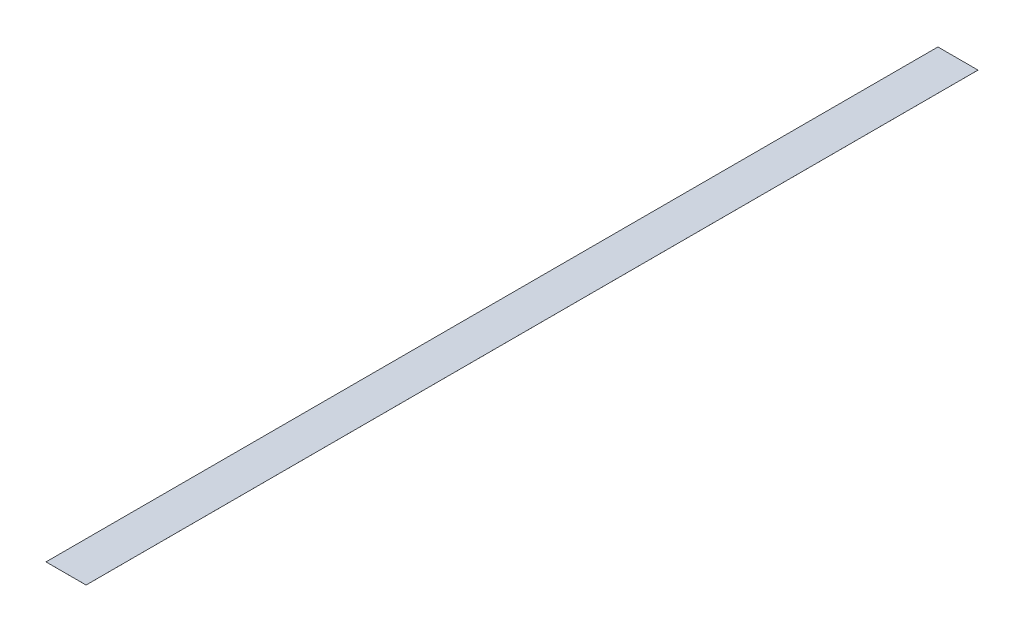
ISO-10303-21;
HEADER;
FILE_DESCRIPTION(('STEP AP214'),'2;1');
FILE_NAME('part.step','',(''),(''),'','','');
FILE_SCHEMA(('AUTOMOTIVE_DESIGN { 1 0 10303 214 1 1 1 1 }'));
ENDSEC;
DATA;
#1=APPLICATION_CONTEXT('core data for automotive mechanical design processes');
#2=APPLICATION_PROTOCOL_DEFINITION('international standard','automotive_design',2000,#1);
#3=PRODUCT_CONTEXT('',#1,'mechanical');
#4=PRODUCT('Part','Part','',(#3));
#5=PRODUCT_RELATED_PRODUCT_CATEGORY('part','',(#4));
#6=PRODUCT_DEFINITION_FORMATION('','',#4);
#7=PRODUCT_DEFINITION_CONTEXT('part definition',#1,'design');
#8=PRODUCT_DEFINITION('design','',#6,#7);
#9=PRODUCT_DEFINITION_SHAPE('','',#8);
#10=(LENGTH_UNIT() NAMED_UNIT(*) SI_UNIT(.MILLI.,.METRE.));
#11=(NAMED_UNIT(*) PLANE_ANGLE_UNIT() SI_UNIT($,.RADIAN.));
#12=(NAMED_UNIT(*) SI_UNIT($,.STERADIAN.) SOLID_ANGLE_UNIT());
#13=UNCERTAINTY_MEASURE_WITH_UNIT(LENGTH_MEASURE(1.E-05),#10,'distance_accuracy_value','');
#14=(GEOMETRIC_REPRESENTATION_CONTEXT(3) GLOBAL_UNCERTAINTY_ASSIGNED_CONTEXT((#13)) GLOBAL_UNIT_ASSIGNED_CONTEXT((#10,
#11,#12)) REPRESENTATION_CONTEXT('',''));
#15=CARTESIAN_POINT('',(0.,0.,0.));
#16=DIRECTION('',(0.,0.,1.));
#17=DIRECTION('',(1.,0.,0.));
#18=AXIS2_PLACEMENT_3D('',#15,#16,#17);
#19=CARTESIAN_POINT('',(434.424178912594,0.01,-1103.73141784687));
#20=DIRECTION('',(0.,0.,-1.));
#21=DIRECTION('',(-1.,0.,0.));
#22=AXIS2_PLACEMENT_3D('',#19,#20,#21);
#23=PLANE('',#22);
#24=DIRECTION('',(1.,0.,0.));
#25=VECTOR('',#24,1.);
#26=CARTESIAN_POINT('',(434.424178912594,0.,-1103.73141784687));
#27=LINE('',#26,#25);
#28=CARTESIAN_POINT('',(434.424178912594,0.,-1103.73141784687));
#29=VERTEX_POINT('',#28);
#30=CARTESIAN_POINT('',(453.358570146949,0.,-1103.73141784687));
#31=VERTEX_POINT('',#30);
#32=EDGE_CURVE('E110',#29,#31,#27,.T.);
#33=ORIENTED_EDGE('',*,*,#32,.F.);
#34=DIRECTION('',(0.,-1.,0.));
#35=VECTOR('',#34,1.);
#36=CARTESIAN_POINT('',(434.424178912594,0.01,-1103.73141784687));
#37=LINE('',#36,#35);
#38=CARTESIAN_POINT('',(434.424178912594,0.01,-1103.73141784687));
#39=VERTEX_POINT('',#38);
#40=EDGE_CURVE('E11',#39,#29,#37,.T.);
#41=ORIENTED_EDGE('',*,*,#40,.F.);
#42=DIRECTION('',(1.,0.,0.));
#43=VECTOR('',#42,1.);
#44=CARTESIAN_POINT('',(434.424178912594,0.01,-1103.73141784687));
#45=LINE('',#44,#43);
#46=CARTESIAN_POINT('',(453.358570146949,0.01,-1103.73141784687));
#47=VERTEX_POINT('',#46);
#48=EDGE_CURVE('E103',#39,#47,#45,.T.);
#49=ORIENTED_EDGE('',*,*,#48,.T.);
#50=DIRECTION('',(0.,-1.,0.));
#51=VECTOR('',#50,1.);
#52=CARTESIAN_POINT('',(453.358570146949,0.01,-1103.73141784687));
#53=LINE('',#52,#51);
#54=EDGE_CURVE('E42',#47,#31,#53,.T.);
#55=ORIENTED_EDGE('',*,*,#54,.T.);
#56=EDGE_LOOP('',(#33,#41,#49,#55));
#57=FACE_BOUND('',#56,.T.);
#58=ADVANCED_FACE('F39',(#57),#23,.T.);
#59=CARTESIAN_POINT('',(434.424178912594,0.01,-1103.73141784687));
#60=DIRECTION('',(1.,0.,0.));
#61=DIRECTION('',(0.,0.,-1.));
#62=AXIS2_PLACEMENT_3D('',#59,#60,#61);
#63=PLANE('',#62);
#64=DIRECTION('',(0.,0.,1.));
#65=VECTOR('',#64,1.);
#66=CARTESIAN_POINT('',(434.424178912594,0.,-1103.73141784687));
#67=LINE('',#66,#65);
#68=CARTESIAN_POINT('',(434.424178912594,0.,-682.401263699655));
#69=VERTEX_POINT('',#68);
#70=EDGE_CURVE('E73',#29,#69,#67,.T.);
#71=ORIENTED_EDGE('',*,*,#70,.T.);
#72=DIRECTION('',(0.,-1.,0.));
#73=VECTOR('',#72,1.);
#74=CARTESIAN_POINT('',(434.424178912594,0.01,-682.401263699655));
#75=LINE('',#74,#73);
#76=CARTESIAN_POINT('',(434.424178912594,0.01,-682.401263699655));
#77=VERTEX_POINT('',#76);
#78=EDGE_CURVE('E49',#77,#69,#75,.T.);
#79=ORIENTED_EDGE('',*,*,#78,.F.);
#80=DIRECTION('',(0.,0.,1.));
#81=VECTOR('',#80,1.);
#82=CARTESIAN_POINT('',(434.424178912594,0.01,-1103.73141784687));
#83=LINE('',#82,#81);
#84=EDGE_CURVE('E90',#39,#77,#83,.T.);
#85=ORIENTED_EDGE('',*,*,#84,.F.);
#86=ORIENTED_EDGE('',*,*,#40,.T.);
#87=EDGE_LOOP('',(#71,#79,#85,#86));
#88=FACE_BOUND('',#87,.T.);
#89=ADVANCED_FACE('F126',(#88),#63,.F.);
#90=CARTESIAN_POINT('',(434.424178912594,0.01,-682.401263699655));
#91=DIRECTION('',(0.,0.,-1.));
#92=DIRECTION('',(-1.,0.,0.));
#93=AXIS2_PLACEMENT_3D('',#90,#91,#92);
#94=PLANE('',#93);
#95=DIRECTION('',(1.,0.,0.));
#96=VECTOR('',#95,1.);
#97=CARTESIAN_POINT('',(434.424178912594,0.,-682.401263699655));
#98=LINE('',#97,#96);
#99=CARTESIAN_POINT('',(453.358570146949,0.,-682.401263699655));
#100=VERTEX_POINT('',#99);
#101=EDGE_CURVE('E98',#69,#100,#98,.T.);
#102=ORIENTED_EDGE('',*,*,#101,.T.);
#103=DIRECTION('',(0.,-1.,0.));
#104=VECTOR('',#103,1.);
#105=CARTESIAN_POINT('',(453.358570146949,0.01,-682.401263699655));
#106=LINE('',#105,#104);
#107=CARTESIAN_POINT('',(453.358570146949,0.01,-682.401263699655));
#108=VERTEX_POINT('',#107);
#109=EDGE_CURVE('E95',#108,#100,#106,.T.);
#110=ORIENTED_EDGE('',*,*,#109,.F.);
#111=DIRECTION('',(1.,0.,0.));
#112=VECTOR('',#111,1.);
#113=CARTESIAN_POINT('',(434.424178912594,0.01,-682.401263699655));
#114=LINE('',#113,#112);
#115=EDGE_CURVE('E85',#77,#108,#114,.T.);
#116=ORIENTED_EDGE('',*,*,#115,.F.);
#117=ORIENTED_EDGE('',*,*,#78,.T.);
#118=EDGE_LOOP('',(#102,#110,#116,#117));
#119=FACE_BOUND('',#118,.T.);
#120=ADVANCED_FACE('F96',(#119),#94,.F.);
#121=CARTESIAN_POINT('',(453.358570146949,0.01,-1103.73141784687));
#122=DIRECTION('',(1.,0.,0.));
#123=DIRECTION('',(0.,0.,-1.));
#124=AXIS2_PLACEMENT_3D('',#121,#122,#123);
#125=PLANE('',#124);
#126=DIRECTION('',(0.,0.,1.));
#127=VECTOR('',#126,1.);
#128=CARTESIAN_POINT('',(453.358570146949,0.,-1103.73141784687));
#129=LINE('',#128,#127);
#130=EDGE_CURVE('E114',#31,#100,#129,.T.);
#131=ORIENTED_EDGE('',*,*,#130,.F.);
#132=ORIENTED_EDGE('',*,*,#54,.F.);
#133=DIRECTION('',(0.,0.,1.));
#134=VECTOR('',#133,1.);
#135=CARTESIAN_POINT('',(453.358570146949,0.01,-1103.73141784687));
#136=LINE('',#135,#134);
#137=EDGE_CURVE('E89',#47,#108,#136,.T.);
#138=ORIENTED_EDGE('',*,*,#137,.T.);
#139=ORIENTED_EDGE('',*,*,#109,.T.);
#140=EDGE_LOOP('',(#131,#132,#138,#139));
#141=FACE_BOUND('',#140,.T.);
#142=ADVANCED_FACE('F101',(#141),#125,.T.);
#143=CARTESIAN_POINT('',(0.,0.01,0.));
#144=DIRECTION('',(0.,-1.,0.));
#145=DIRECTION('',(0.,0.,-1.));
#146=AXIS2_PLACEMENT_3D('',#143,#144,#145);
#147=PLANE('',#146);
#148=ORIENTED_EDGE('',*,*,#48,.F.);
#149=ORIENTED_EDGE('',*,*,#84,.T.);
#150=ORIENTED_EDGE('',*,*,#115,.T.);
#151=ORIENTED_EDGE('',*,*,#137,.F.);
#152=EDGE_LOOP('',(#148,#149,#150,#151));
#153=FACE_BOUND('',#152,.T.);
#154=ADVANCED_FACE('F88',(#153),#147,.F.);
#155=CARTESIAN_POINT('',(0.,0.,0.));
#156=DIRECTION('',(0.,-1.,0.));
#157=DIRECTION('',(0.,0.,-1.));
#158=AXIS2_PLACEMENT_3D('',#155,#156,#157);
#159=PLANE('',#158);
#160=ORIENTED_EDGE('',*,*,#32,.T.);
#161=ORIENTED_EDGE('',*,*,#130,.T.);
#162=ORIENTED_EDGE('',*,*,#101,.F.);
#163=ORIENTED_EDGE('',*,*,#70,.F.);
#164=EDGE_LOOP('',(#160,#161,#162,#163));
#165=FACE_BOUND('',#164,.T.);
#166=ADVANCED_FACE('F123',(#165),#159,.T.);
#167=CLOSED_SHELL('',(#58,#89,#120,#142,#154,#166));
#168=MANIFOLD_SOLID_BREP('B2',#167);
#169=ADVANCED_BREP_SHAPE_REPRESENTATION('',(#18,#168),#14);
#170=SHAPE_DEFINITION_REPRESENTATION(#9,#169);
ENDSEC;
END-ISO-10303-21;
